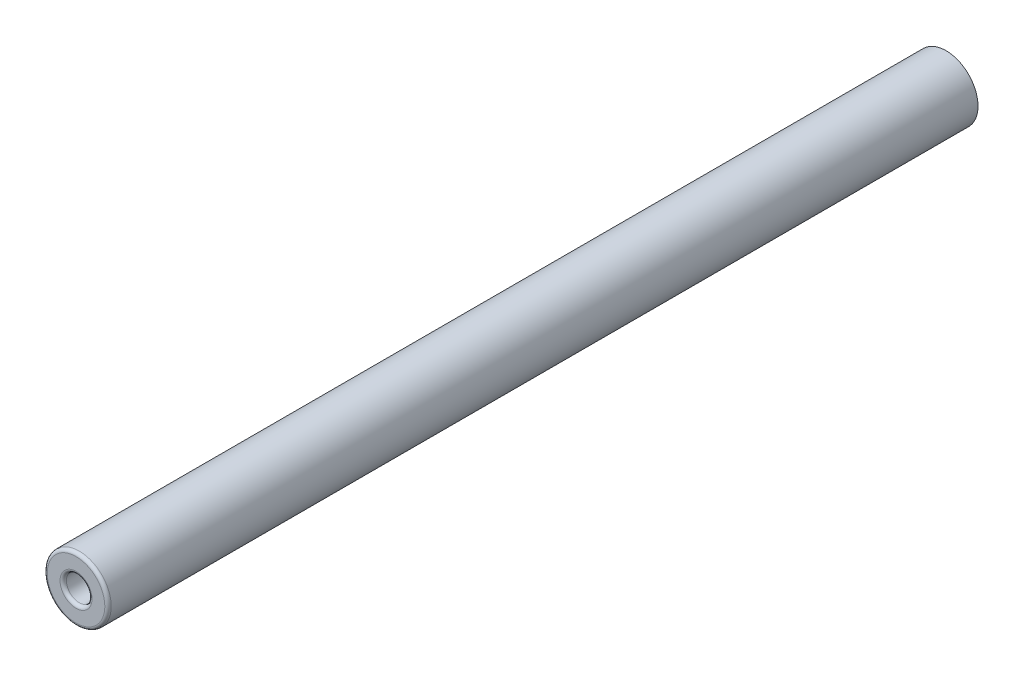
ISO-10303-21;
HEADER;
FILE_DESCRIPTION(('STEP AP214'),'2;1');
FILE_NAME('part.step','',(''),(''),'','','');
FILE_SCHEMA(('AUTOMOTIVE_DESIGN { 1 0 10303 214 1 1 1 1 }'));
ENDSEC;
DATA;
#1=APPLICATION_CONTEXT('core data for automotive mechanical design processes');
#2=APPLICATION_PROTOCOL_DEFINITION('international standard','automotive_design',2000,#1);
#3=PRODUCT_CONTEXT('',#1,'mechanical');
#4=PRODUCT('Part','Part','',(#3));
#5=PRODUCT_RELATED_PRODUCT_CATEGORY('part','',(#4));
#6=PRODUCT_DEFINITION_FORMATION('','',#4);
#7=PRODUCT_DEFINITION_CONTEXT('part definition',#1,'design');
#8=PRODUCT_DEFINITION('design','',#6,#7);
#9=PRODUCT_DEFINITION_SHAPE('','',#8);
#10=(LENGTH_UNIT() NAMED_UNIT(*) SI_UNIT(.MILLI.,.METRE.));
#11=(NAMED_UNIT(*) PLANE_ANGLE_UNIT() SI_UNIT($,.RADIAN.));
#12=(NAMED_UNIT(*) SI_UNIT($,.STERADIAN.) SOLID_ANGLE_UNIT());
#13=UNCERTAINTY_MEASURE_WITH_UNIT(LENGTH_MEASURE(1.E-05),#10,'distance_accuracy_value','');
#14=(GEOMETRIC_REPRESENTATION_CONTEXT(3) GLOBAL_UNCERTAINTY_ASSIGNED_CONTEXT((#13)) GLOBAL_UNIT_ASSIGNED_CONTEXT((#10,
#11,#12)) REPRESENTATION_CONTEXT('',''));
#15=CARTESIAN_POINT('',(0.,0.,0.));
#16=DIRECTION('',(0.,0.,1.));
#17=DIRECTION('',(1.,0.,0.));
#18=AXIS2_PLACEMENT_3D('',#15,#16,#17);
#19=CARTESIAN_POINT('',(0.,0.,151.940048298356));
#20=DIRECTION('',(0.,0.,-1.));
#21=DIRECTION('',(-1.,0.,0.));
#22=AXIS2_PLACEMENT_3D('',#19,#20,#21);
#23=CYLINDRICAL_SURFACE('',#22,3.75);
#24=CARTESIAN_POINT('',(0.,0.,151.565048298356));
#25=DIRECTION('',(0.,0.,1.));
#26=DIRECTION('',(1.,0.,0.));
#27=AXIS2_PLACEMENT_3D('',#24,#25,#26);
#28=CIRCLE('',#27,3.75);
#29=CARTESIAN_POINT('',(3.75,0.,151.565048298356));
#30=VERTEX_POINT('',#29);
#31=EDGE_CURVE('E50',#30,#30,#28,.F.);
#32=ORIENTED_EDGE('',*,*,#31,.T.);
#33=EDGE_LOOP('',(#32));
#34=FACE_BOUND('',#33,.T.);
#35=CARTESIAN_POINT('',(0.,0.,49.9400482983555));
#36=DIRECTION('',(0.,0.,1.));
#37=DIRECTION('',(1.,0.,0.));
#38=AXIS2_PLACEMENT_3D('',#35,#36,#37);
#39=CIRCLE('',#38,3.75);
#40=CARTESIAN_POINT('',(3.75,0.,49.9400482983555));
#41=VERTEX_POINT('',#40);
#42=EDGE_CURVE('E63',#41,#41,#39,.T.);
#43=ORIENTED_EDGE('',*,*,#42,.T.);
#44=EDGE_LOOP('',(#43));
#45=FACE_BOUND('',#44,.T.);
#46=ADVANCED_FACE('F43',(#34,#45),#23,.T.);
#47=CARTESIAN_POINT('',(0.,0.,151.940048298356));
#48=DIRECTION('',(0.,0.,1.));
#49=DIRECTION('',(1.,0.,0.));
#50=AXIS2_PLACEMENT_3D('',#47,#48,#49);
#51=PLANE('',#50);
#52=CARTESIAN_POINT('',(0.,0.,151.940048298356));
#53=DIRECTION('',(0.,0.,1.));
#54=DIRECTION('',(1.,0.,0.));
#55=AXIS2_PLACEMENT_3D('',#52,#53,#54);
#56=CIRCLE('',#55,3.375);
#57=CARTESIAN_POINT('',(3.375,0.,151.940048298356));
#58=VERTEX_POINT('',#57);
#59=EDGE_CURVE('E54',#58,#58,#56,.T.);
#60=ORIENTED_EDGE('',*,*,#59,.T.);
#61=EDGE_LOOP('',(#60));
#62=FACE_BOUND('',#61,.T.);
#63=CARTESIAN_POINT('',(0.,0.,151.940048298356));
#64=DIRECTION('',(0.,0.,1.));
#65=DIRECTION('',(1.,0.,0.));
#66=AXIS2_PLACEMENT_3D('',#63,#64,#65);
#67=CIRCLE('',#66,1.875);
#68=CARTESIAN_POINT('',(1.875,0.,151.940048298356));
#69=VERTEX_POINT('',#68);
#70=EDGE_CURVE('E58',#69,#69,#67,.F.);
#71=ORIENTED_EDGE('',*,*,#70,.T.);
#72=EDGE_LOOP('',(#71));
#73=FACE_BOUND('',#72,.T.);
#74=ADVANCED_FACE('F82',(#62,#73),#51,.T.);
#75=CARTESIAN_POINT('',(0.,0.,49.9400482983555));
#76=DIRECTION('',(0.,0.,1.));
#77=DIRECTION('',(1.,0.,0.));
#78=AXIS2_PLACEMENT_3D('',#75,#76,#77);
#79=PLANE('',#78);
#80=ORIENTED_EDGE('',*,*,#42,.F.);
#81=EDGE_LOOP('',(#80));
#82=FACE_BOUND('',#81,.T.);
#83=ADVANCED_FACE('F74',(#82),#79,.F.);
#84=CARTESIAN_POINT('',(0.,0.,136.940048298356));
#85=DIRECTION('',(0.,0.,1.));
#86=DIRECTION('',(1.,0.,0.));
#87=AXIS2_PLACEMENT_3D('',#84,#85,#86);
#88=CYLINDRICAL_SURFACE('',#87,1.5);
#89=CARTESIAN_POINT('',(0.,0.,151.565048298356));
#90=DIRECTION('',(0.,0.,1.));
#91=DIRECTION('',(1.,0.,0.));
#92=AXIS2_PLACEMENT_3D('',#89,#90,#91);
#93=CIRCLE('',#92,1.5);
#94=CARTESIAN_POINT('',(1.5,0.,151.565048298356));
#95=VERTEX_POINT('',#94);
#96=EDGE_CURVE('E10',#95,#95,#93,.T.);
#97=ORIENTED_EDGE('',*,*,#96,.T.);
#98=EDGE_LOOP('',(#97));
#99=FACE_BOUND('',#98,.T.);
#100=CARTESIAN_POINT('',(0.,0.,136.940048298356));
#101=DIRECTION('',(0.,0.,1.));
#102=DIRECTION('',(1.,0.,0.));
#103=AXIS2_PLACEMENT_3D('',#100,#101,#102);
#104=CIRCLE('',#103,1.5);
#105=CARTESIAN_POINT('',(1.5,0.,136.940048298356));
#106=VERTEX_POINT('',#105);
#107=EDGE_CURVE('E66',#106,#106,#104,.T.);
#108=ORIENTED_EDGE('',*,*,#107,.F.);
#109=EDGE_LOOP('',(#108));
#110=FACE_BOUND('',#109,.T.);
#111=ADVANCED_FACE('F72',(#99,#110),#88,.F.);
#112=CARTESIAN_POINT('',(0.,0.,136.940048298356));
#113=DIRECTION('',(0.,0.,1.));
#114=DIRECTION('',(1.,0.,0.));
#115=AXIS2_PLACEMENT_3D('',#112,#113,#114);
#116=PLANE('',#115);
#117=ORIENTED_EDGE('',*,*,#107,.T.);
#118=EDGE_LOOP('',(#117));
#119=FACE_BOUND('',#118,.T.);
#120=ADVANCED_FACE('F70',(#119),#116,.T.);
#121=CARTESIAN_POINT('',(0.,0.,151.565048298356));
#122=DIRECTION('',(0.,0.,1.));
#123=DIRECTION('',(1.,0.,0.));
#124=AXIS2_PLACEMENT_3D('',#121,#122,#123);
#125=TOROIDAL_SURFACE('',#124,3.375,0.375);
#126=ORIENTED_EDGE('',*,*,#31,.F.);
#127=EDGE_LOOP('',(#126));
#128=FACE_BOUND('',#127,.T.);
#129=ORIENTED_EDGE('',*,*,#59,.F.);
#130=EDGE_LOOP('',(#129));
#131=FACE_BOUND('',#130,.T.);
#132=ADVANCED_FACE('F80',(#128,#131),#125,.T.);
#133=CARTESIAN_POINT('',(0.,0.,151.565048298356));
#134=DIRECTION('',(0.,0.,1.));
#135=DIRECTION('',(1.,0.,0.));
#136=AXIS2_PLACEMENT_3D('',#133,#134,#135);
#137=TOROIDAL_SURFACE('',#136,1.875,0.375);
#138=ORIENTED_EDGE('',*,*,#70,.F.);
#139=EDGE_LOOP('',(#138));
#140=FACE_BOUND('',#139,.T.);
#141=ORIENTED_EDGE('',*,*,#96,.F.);
#142=EDGE_LOOP('',(#141));
#143=FACE_BOUND('',#142,.T.);
#144=ADVANCED_FACE('F45',(#140,#143),#137,.T.);
#145=CLOSED_SHELL('',(#46,#74,#83,#111,#120,#132,#144));
#146=MANIFOLD_SOLID_BREP('B2',#145);
#147=ADVANCED_BREP_SHAPE_REPRESENTATION('',(#18,#146),#14);
#148=SHAPE_DEFINITION_REPRESENTATION(#9,#147);
ENDSEC;
END-ISO-10303-21;
